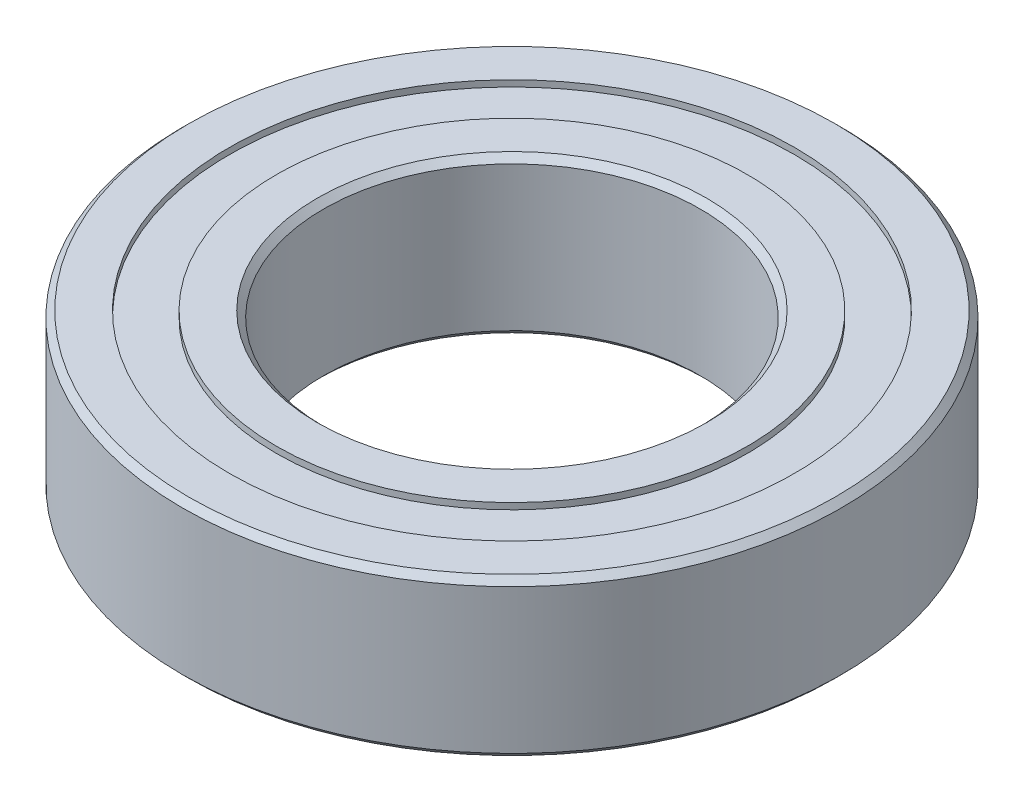
ISO-10303-21;
HEADER;
FILE_DESCRIPTION(('STEP AP214'),'2;1');
FILE_NAME('part.step','',(''),(''),'','','');
FILE_SCHEMA(('AUTOMOTIVE_DESIGN { 1 0 10303 214 1 1 1 1 }'));
ENDSEC;
DATA;
#1=APPLICATION_CONTEXT('core data for automotive mechanical design processes');
#2=APPLICATION_PROTOCOL_DEFINITION('international standard','automotive_design',2000,#1);
#3=PRODUCT_CONTEXT('',#1,'mechanical');
#4=PRODUCT('Part','Part','',(#3));
#5=PRODUCT_RELATED_PRODUCT_CATEGORY('part','',(#4));
#6=PRODUCT_DEFINITION_FORMATION('','',#4);
#7=PRODUCT_DEFINITION_CONTEXT('part definition',#1,'design');
#8=PRODUCT_DEFINITION('design','',#6,#7);
#9=PRODUCT_DEFINITION_SHAPE('','',#8);
#10=(LENGTH_UNIT() NAMED_UNIT(*) SI_UNIT(.MILLI.,.METRE.));
#11=(NAMED_UNIT(*) PLANE_ANGLE_UNIT() SI_UNIT($,.RADIAN.));
#12=(NAMED_UNIT(*) SI_UNIT($,.STERADIAN.) SOLID_ANGLE_UNIT());
#13=UNCERTAINTY_MEASURE_WITH_UNIT(LENGTH_MEASURE(1.E-05),#10,'distance_accuracy_value','');
#14=(GEOMETRIC_REPRESENTATION_CONTEXT(3) GLOBAL_UNCERTAINTY_ASSIGNED_CONTEXT((#13)) GLOBAL_UNIT_ASSIGNED_CONTEXT((#10,
#11,#12)) REPRESENTATION_CONTEXT('',''));
#15=CARTESIAN_POINT('',(0.,0.,0.));
#16=DIRECTION('',(0.,0.,1.));
#17=DIRECTION('',(1.,0.,0.));
#18=AXIS2_PLACEMENT_3D('',#15,#16,#17);
#19=CARTESIAN_POINT('',(0.,0.,0.));
#20=DIRECTION('',(0.,1.,0.));
#21=DIRECTION('',(0.,0.,1.));
#22=AXIS2_PLACEMENT_3D('',#19,#20,#21);
#23=PLANE('',#22);
#24=CARTESIAN_POINT('',(0.,0.,0.));
#25=DIRECTION('',(0.,1.,0.));
#26=DIRECTION('',(0.,0.,1.));
#27=AXIS2_PLACEMENT_3D('',#24,#25,#26);
#28=CIRCLE('',#27,6.19999999999999);
#29=CARTESIAN_POINT('',(0.,0.,6.19999999999999));
#30=VERTEX_POINT('',#29);
#31=EDGE_CURVE('E10',#30,#30,#28,.T.);
#32=ORIENTED_EDGE('',*,*,#31,.T.);
#33=EDGE_LOOP('',(#32));
#34=FACE_BOUND('',#33,.T.);
#35=CARTESIAN_POINT('',(0.,0.,0.));
#36=DIRECTION('',(0.,-1.,0.));
#37=DIRECTION('',(0.,0.,-1.));
#38=AXIS2_PLACEMENT_3D('',#35,#36,#37);
#39=CIRCLE('',#38,7.5);
#40=CARTESIAN_POINT('',(0.,0.,-7.5));
#41=VERTEX_POINT('',#40);
#42=EDGE_CURVE('E86',#41,#41,#39,.T.);
#43=ORIENTED_EDGE('',*,*,#42,.T.);
#44=EDGE_LOOP('',(#43));
#45=FACE_BOUND('',#44,.T.);
#46=ADVANCED_FACE('F34',(#34,#45),#23,.F.);
#47=CARTESIAN_POINT('',(0.,5.,0.));
#48=DIRECTION('',(0.,1.,0.));
#49=DIRECTION('',(0.,0.,1.));
#50=AXIS2_PLACEMENT_3D('',#47,#48,#49);
#51=PLANE('',#50);
#52=CARTESIAN_POINT('',(0.,5.,0.));
#53=DIRECTION('',(0.,1.,0.));
#54=DIRECTION('',(0.,0.,1.));
#55=AXIS2_PLACEMENT_3D('',#52,#53,#54);
#56=CIRCLE('',#55,6.2);
#57=CARTESIAN_POINT('',(0.,5.,6.2));
#58=VERTEX_POINT('',#57);
#59=EDGE_CURVE('E42',#58,#58,#56,.F.);
#60=ORIENTED_EDGE('',*,*,#59,.T.);
#61=EDGE_LOOP('',(#60));
#62=FACE_BOUND('',#61,.T.);
#63=CARTESIAN_POINT('',(0.,5.,0.));
#64=DIRECTION('',(0.,1.,0.));
#65=DIRECTION('',(0.,0.,1.));
#66=AXIS2_PLACEMENT_3D('',#63,#64,#65);
#67=CIRCLE('',#66,7.5);
#68=CARTESIAN_POINT('',(0.,5.,7.5));
#69=VERTEX_POINT('',#68);
#70=EDGE_CURVE('E74',#69,#69,#67,.T.);
#71=ORIENTED_EDGE('',*,*,#70,.T.);
#72=EDGE_LOOP('',(#71));
#73=FACE_BOUND('',#72,.T.);
#74=ADVANCED_FACE('F121',(#62,#73),#51,.T.);
#75=CARTESIAN_POINT('',(0.,5.,0.));
#76=DIRECTION('',(0.,1.,0.));
#77=DIRECTION('',(0.,0.,1.));
#78=AXIS2_PLACEMENT_3D('',#75,#76,#77);
#79=CIRCLE('',#78,10.3);
#80=CARTESIAN_POINT('',(0.,5.,10.3));
#81=VERTEX_POINT('',#80);
#82=EDGE_CURVE('E64',#81,#81,#79,.T.);
#83=ORIENTED_EDGE('',*,*,#82,.T.);
#84=EDGE_LOOP('',(#83));
#85=FACE_BOUND('',#84,.T.);
#86=CARTESIAN_POINT('',(0.,5.,0.));
#87=DIRECTION('',(0.,1.,0.));
#88=DIRECTION('',(0.,0.,1.));
#89=AXIS2_PLACEMENT_3D('',#86,#87,#88);
#90=CIRCLE('',#89,9.);
#91=CARTESIAN_POINT('',(0.,5.,9.));
#92=VERTEX_POINT('',#91);
#93=EDGE_CURVE('E68',#92,#92,#90,.T.);
#94=ORIENTED_EDGE('',*,*,#93,.F.);
#95=EDGE_LOOP('',(#94));
#96=FACE_BOUND('',#95,.T.);
#97=ADVANCED_FACE('F111',(#85,#96),#51,.T.);
#98=CARTESIAN_POINT('',(0.,0.,0.));
#99=DIRECTION('',(0.,1.,0.));
#100=DIRECTION('',(0.,0.,1.));
#101=AXIS2_PLACEMENT_3D('',#98,#99,#100);
#102=CIRCLE('',#101,10.3);
#103=CARTESIAN_POINT('',(0.,0.,10.3));
#104=VERTEX_POINT('',#103);
#105=EDGE_CURVE('E55',#104,#104,#102,.F.);
#106=ORIENTED_EDGE('',*,*,#105,.T.);
#107=EDGE_LOOP('',(#106));
#108=FACE_BOUND('',#107,.T.);
#109=CARTESIAN_POINT('',(0.,0.,0.));
#110=DIRECTION('',(0.,-1.,0.));
#111=DIRECTION('',(0.,0.,-1.));
#112=AXIS2_PLACEMENT_3D('',#109,#110,#111);
#113=CIRCLE('',#112,9.);
#114=CARTESIAN_POINT('',(0.,0.,-9.));
#115=VERTEX_POINT('',#114);
#116=EDGE_CURVE('E80',#115,#115,#113,.T.);
#117=ORIENTED_EDGE('',*,*,#116,.F.);
#118=EDGE_LOOP('',(#117));
#119=FACE_BOUND('',#118,.T.);
#120=ADVANCED_FACE('F108',(#108,#119),#23,.F.);
#121=CARTESIAN_POINT('',(0.,5.,0.));
#122=DIRECTION('',(0.,-1.,0.));
#123=DIRECTION('',(0.,0.,-1.));
#124=AXIS2_PLACEMENT_3D('',#121,#122,#123);
#125=CYLINDRICAL_SURFACE('',#124,10.5);
#126=CARTESIAN_POINT('',(0.,4.79999999999999,0.));
#127=DIRECTION('',(0.,1.,0.));
#128=DIRECTION('',(0.,0.,1.));
#129=AXIS2_PLACEMENT_3D('',#126,#127,#128);
#130=CIRCLE('',#129,10.5);
#131=CARTESIAN_POINT('',(0.,4.79999999999999,10.5));
#132=VERTEX_POINT('',#131);
#133=EDGE_CURVE('E58',#132,#132,#130,.F.);
#134=ORIENTED_EDGE('',*,*,#133,.T.);
#135=EDGE_LOOP('',(#134));
#136=FACE_BOUND('',#135,.T.);
#137=CARTESIAN_POINT('',(0.,0.199999999999997,0.));
#138=DIRECTION('',(0.,1.,0.));
#139=DIRECTION('',(0.,0.,1.));
#140=AXIS2_PLACEMENT_3D('',#137,#138,#139);
#141=CIRCLE('',#140,10.5);
#142=CARTESIAN_POINT('',(0.,0.199999999999997,10.5));
#143=VERTEX_POINT('',#142);
#144=EDGE_CURVE('E61',#143,#143,#141,.T.);
#145=ORIENTED_EDGE('',*,*,#144,.T.);
#146=EDGE_LOOP('',(#145));
#147=FACE_BOUND('',#146,.T.);
#148=ADVANCED_FACE('F110',(#136,#147),#125,.T.);
#149=CARTESIAN_POINT('',(0.,5.,0.));
#150=DIRECTION('',(0.,-1.,0.));
#151=DIRECTION('',(0.,0.,-1.));
#152=AXIS2_PLACEMENT_3D('',#149,#150,#151);
#153=CYLINDRICAL_SURFACE('',#152,6.);
#154=CARTESIAN_POINT('',(0.,4.8,0.));
#155=DIRECTION('',(0.,1.,0.));
#156=DIRECTION('',(0.,0.,1.));
#157=AXIS2_PLACEMENT_3D('',#154,#155,#156);
#158=CIRCLE('',#157,6.);
#159=CARTESIAN_POINT('',(0.,4.8,6.));
#160=VERTEX_POINT('',#159);
#161=EDGE_CURVE('E46',#160,#160,#158,.T.);
#162=ORIENTED_EDGE('',*,*,#161,.T.);
#163=EDGE_LOOP('',(#162));
#164=FACE_BOUND('',#163,.T.);
#165=CARTESIAN_POINT('',(0.,0.199999999999995,0.));
#166=DIRECTION('',(0.,1.,0.));
#167=DIRECTION('',(0.,0.,1.));
#168=AXIS2_PLACEMENT_3D('',#165,#166,#167);
#169=CIRCLE('',#168,6.);
#170=CARTESIAN_POINT('',(0.,0.199999999999995,6.));
#171=VERTEX_POINT('',#170);
#172=EDGE_CURVE('E50',#171,#171,#169,.F.);
#173=ORIENTED_EDGE('',*,*,#172,.T.);
#174=EDGE_LOOP('',(#173));
#175=FACE_BOUND('',#174,.T.);
#176=ADVANCED_FACE('F118',(#164,#175),#153,.F.);
#177=CARTESIAN_POINT('',(0.,4.8,0.));
#178=DIRECTION('',(0.,1.,0.));
#179=DIRECTION('',(0.,0.,1.));
#180=AXIS2_PLACEMENT_3D('',#177,#178,#179);
#181=CYLINDRICAL_SURFACE('',#180,9.);
#182=CARTESIAN_POINT('',(0.,4.8,0.));
#183=DIRECTION('',(0.,1.,0.));
#184=DIRECTION('',(0.,0.,1.));
#185=AXIS2_PLACEMENT_3D('',#182,#183,#184);
#186=CIRCLE('',#185,9.);
#187=CARTESIAN_POINT('',(0.,4.8,9.));
#188=VERTEX_POINT('',#187);
#189=EDGE_CURVE('E67',#188,#188,#186,.T.);
#190=ORIENTED_EDGE('',*,*,#189,.F.);
#191=EDGE_LOOP('',(#190));
#192=FACE_BOUND('',#191,.T.);
#193=ORIENTED_EDGE('',*,*,#93,.T.);
#194=EDGE_LOOP('',(#193));
#195=FACE_BOUND('',#194,.T.);
#196=ADVANCED_FACE('F146',(#192,#195),#181,.F.);
#197=CARTESIAN_POINT('',(0.,4.8,0.));
#198=DIRECTION('',(0.,1.,0.));
#199=DIRECTION('',(0.,0.,1.));
#200=AXIS2_PLACEMENT_3D('',#197,#198,#199);
#201=PLANE('',#200);
#202=CARTESIAN_POINT('',(0.,4.8,0.));
#203=DIRECTION('',(0.,1.,0.));
#204=DIRECTION('',(0.,0.,1.));
#205=AXIS2_PLACEMENT_3D('',#202,#203,#204);
#206=CIRCLE('',#205,7.5);
#207=CARTESIAN_POINT('',(0.,4.8,7.5));
#208=VERTEX_POINT('',#207);
#209=EDGE_CURVE('E71',#208,#208,#206,.T.);
#210=ORIENTED_EDGE('',*,*,#209,.F.);
#211=EDGE_LOOP('',(#210));
#212=FACE_BOUND('',#211,.T.);
#213=ORIENTED_EDGE('',*,*,#189,.T.);
#214=EDGE_LOOP('',(#213));
#215=FACE_BOUND('',#214,.T.);
#216=ADVANCED_FACE('F142',(#212,#215),#201,.T.);
#217=CARTESIAN_POINT('',(0.,4.8,0.));
#218=DIRECTION('',(0.,1.,0.));
#219=DIRECTION('',(0.,0.,1.));
#220=AXIS2_PLACEMENT_3D('',#217,#218,#219);
#221=CYLINDRICAL_SURFACE('',#220,7.5);
#222=ORIENTED_EDGE('',*,*,#209,.T.);
#223=EDGE_LOOP('',(#222));
#224=FACE_BOUND('',#223,.T.);
#225=ORIENTED_EDGE('',*,*,#70,.F.);
#226=EDGE_LOOP('',(#225));
#227=FACE_BOUND('',#226,.T.);
#228=ADVANCED_FACE('F104',(#224,#227),#221,.T.);
#229=CARTESIAN_POINT('',(0.,0.2,0.));
#230=DIRECTION('',(0.,-1.,0.));
#231=DIRECTION('',(0.,0.,-1.));
#232=AXIS2_PLACEMENT_3D('',#229,#230,#231);
#233=CYLINDRICAL_SURFACE('',#232,9.);
#234=CARTESIAN_POINT('',(0.,0.2,0.));
#235=DIRECTION('',(0.,-1.,0.));
#236=DIRECTION('',(0.,0.,-1.));
#237=AXIS2_PLACEMENT_3D('',#234,#235,#236);
#238=CIRCLE('',#237,9.);
#239=CARTESIAN_POINT('',(0.,0.2,-9.));
#240=VERTEX_POINT('',#239);
#241=EDGE_CURVE('E77',#240,#240,#238,.T.);
#242=ORIENTED_EDGE('',*,*,#241,.F.);
#243=EDGE_LOOP('',(#242));
#244=FACE_BOUND('',#243,.T.);
#245=ORIENTED_EDGE('',*,*,#116,.T.);
#246=EDGE_LOOP('',(#245));
#247=FACE_BOUND('',#246,.T.);
#248=ADVANCED_FACE('F98',(#244,#247),#233,.F.);
#249=CARTESIAN_POINT('',(0.,0.2,0.));
#250=DIRECTION('',(0.,-1.,0.));
#251=DIRECTION('',(0.,0.,-1.));
#252=AXIS2_PLACEMENT_3D('',#249,#250,#251);
#253=PLANE('',#252);
#254=CARTESIAN_POINT('',(0.,0.2,0.));
#255=DIRECTION('',(0.,-1.,0.));
#256=DIRECTION('',(0.,0.,-1.));
#257=AXIS2_PLACEMENT_3D('',#254,#255,#256);
#258=CIRCLE('',#257,7.5);
#259=CARTESIAN_POINT('',(0.,0.2,-7.5));
#260=VERTEX_POINT('',#259);
#261=EDGE_CURVE('E83',#260,#260,#258,.T.);
#262=ORIENTED_EDGE('',*,*,#261,.F.);
#263=EDGE_LOOP('',(#262));
#264=FACE_BOUND('',#263,.T.);
#265=ORIENTED_EDGE('',*,*,#241,.T.);
#266=EDGE_LOOP('',(#265));
#267=FACE_BOUND('',#266,.T.);
#268=ADVANCED_FACE('F95',(#264,#267),#253,.T.);
#269=CARTESIAN_POINT('',(0.,0.2,0.));
#270=DIRECTION('',(0.,-1.,0.));
#271=DIRECTION('',(0.,0.,-1.));
#272=AXIS2_PLACEMENT_3D('',#269,#270,#271);
#273=CYLINDRICAL_SURFACE('',#272,7.5);
#274=ORIENTED_EDGE('',*,*,#261,.T.);
#275=EDGE_LOOP('',(#274));
#276=FACE_BOUND('',#275,.T.);
#277=ORIENTED_EDGE('',*,*,#42,.F.);
#278=EDGE_LOOP('',(#277));
#279=FACE_BOUND('',#278,.T.);
#280=ADVANCED_FACE('F92',(#276,#279),#273,.T.);
#281=CARTESIAN_POINT('',(0.,5.,0.));
#282=DIRECTION('',(0.,-1.,0.));
#283=DIRECTION('',(0.,0.,-1.));
#284=AXIS2_PLACEMENT_3D('',#281,#282,#283);
#285=CONICAL_SURFACE('',#284,10.3,0.785398163397448);
#286=ORIENTED_EDGE('',*,*,#133,.F.);
#287=EDGE_LOOP('',(#286));
#288=FACE_BOUND('',#287,.T.);
#289=ORIENTED_EDGE('',*,*,#82,.F.);
#290=EDGE_LOOP('',(#289));
#291=FACE_BOUND('',#290,.T.);
#292=ADVANCED_FACE('F131',(#288,#291),#285,.T.);
#293=CARTESIAN_POINT('',(0.,0.199999999999997,0.));
#294=DIRECTION('',(0.,1.,0.));
#295=DIRECTION('',(0.,0.,1.));
#296=AXIS2_PLACEMENT_3D('',#293,#294,#295);
#297=CONICAL_SURFACE('',#296,10.5,0.785398163397453);
#298=ORIENTED_EDGE('',*,*,#105,.F.);
#299=EDGE_LOOP('',(#298));
#300=FACE_BOUND('',#299,.T.);
#301=ORIENTED_EDGE('',*,*,#144,.F.);
#302=EDGE_LOOP('',(#301));
#303=FACE_BOUND('',#302,.T.);
#304=ADVANCED_FACE('F136',(#300,#303),#297,.T.);
#305=CARTESIAN_POINT('',(0.,4.8,0.));
#306=DIRECTION('',(0.,1.,0.));
#307=DIRECTION('',(0.,0.,1.));
#308=AXIS2_PLACEMENT_3D('',#305,#306,#307);
#309=CONICAL_SURFACE('',#308,6.,0.785398163397453);
#310=ORIENTED_EDGE('',*,*,#59,.F.);
#311=EDGE_LOOP('',(#310));
#312=FACE_BOUND('',#311,.T.);
#313=ORIENTED_EDGE('',*,*,#161,.F.);
#314=EDGE_LOOP('',(#313));
#315=FACE_BOUND('',#314,.T.);
#316=ADVANCED_FACE('F161',(#312,#315),#309,.F.);
#317=CARTESIAN_POINT('',(0.,0.,0.));
#318=DIRECTION('',(0.,-1.,0.));
#319=DIRECTION('',(0.,0.,-1.));
#320=AXIS2_PLACEMENT_3D('',#317,#318,#319);
#321=CONICAL_SURFACE('',#320,6.19999999999999,0.785398163397444);
#322=ORIENTED_EDGE('',*,*,#172,.F.);
#323=EDGE_LOOP('',(#322));
#324=FACE_BOUND('',#323,.T.);
#325=ORIENTED_EDGE('',*,*,#31,.F.);
#326=EDGE_LOOP('',(#325));
#327=FACE_BOUND('',#326,.T.);
#328=ADVANCED_FACE('F37',(#324,#327),#321,.F.);
#329=CLOSED_SHELL('',(#46,#74,#97,#120,#148,#176,#196,#216,#228,#248,#268,#280,#292,#304,#316,#328));
#330=MANIFOLD_SOLID_BREP('B2',#329);
#331=ADVANCED_BREP_SHAPE_REPRESENTATION('',(#18,#330),#14);
#332=SHAPE_DEFINITION_REPRESENTATION(#9,#331);
ENDSEC;
END-ISO-10303-21;
